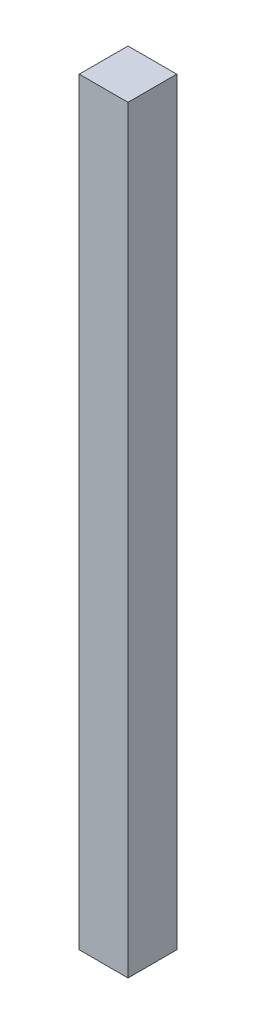
ISO-10303-21;
HEADER;
FILE_DESCRIPTION(('STEP AP214'),'2;1');
FILE_NAME('part.step','',(''),(''),'','','');
FILE_SCHEMA(('AUTOMOTIVE_DESIGN { 1 0 10303 214 1 1 1 1 }'));
ENDSEC;
DATA;
#1=APPLICATION_CONTEXT('core data for automotive mechanical design processes');
#2=APPLICATION_PROTOCOL_DEFINITION('international standard','automotive_design',2000,#1);
#3=PRODUCT_CONTEXT('',#1,'mechanical');
#4=PRODUCT('Part','Part','',(#3));
#5=PRODUCT_RELATED_PRODUCT_CATEGORY('part','',(#4));
#6=PRODUCT_DEFINITION_FORMATION('','',#4);
#7=PRODUCT_DEFINITION_CONTEXT('part definition',#1,'design');
#8=PRODUCT_DEFINITION('design','',#6,#7);
#9=PRODUCT_DEFINITION_SHAPE('','',#8);
#10=(LENGTH_UNIT() NAMED_UNIT(*) SI_UNIT(.MILLI.,.METRE.));
#11=(NAMED_UNIT(*) PLANE_ANGLE_UNIT() SI_UNIT($,.RADIAN.));
#12=(NAMED_UNIT(*) SI_UNIT($,.STERADIAN.) SOLID_ANGLE_UNIT());
#13=UNCERTAINTY_MEASURE_WITH_UNIT(LENGTH_MEASURE(1.E-05),#10,'distance_accuracy_value','');
#14=(GEOMETRIC_REPRESENTATION_CONTEXT(3) GLOBAL_UNCERTAINTY_ASSIGNED_CONTEXT((#13)) GLOBAL_UNIT_ASSIGNED_CONTEXT((#10,
#11,#12)) REPRESENTATION_CONTEXT('',''));
#15=CARTESIAN_POINT('',(0.,0.,0.));
#16=DIRECTION('',(0.,0.,1.));
#17=DIRECTION('',(1.,0.,0.));
#18=AXIS2_PLACEMENT_3D('',#15,#16,#17);
#19=CARTESIAN_POINT('',(0.,311.,0.));
#20=DIRECTION('',(1.,0.,0.));
#21=DIRECTION('',(0.,0.,-1.));
#22=AXIS2_PLACEMENT_3D('',#19,#20,#21);
#23=PLANE('',#22);
#24=DIRECTION('',(0.,0.,1.));
#25=VECTOR('',#24,1.);
#26=CARTESIAN_POINT('',(0.,0.,0.));
#27=LINE('',#26,#25);
#28=CARTESIAN_POINT('',(0.,0.,-20.));
#29=VERTEX_POINT('',#28);
#30=CARTESIAN_POINT('',(0.,0.,0.));
#31=VERTEX_POINT('',#30);
#32=EDGE_CURVE('E107',#29,#31,#27,.T.);
#33=ORIENTED_EDGE('',*,*,#32,.T.);
#34=DIRECTION('',(0.,-1.,0.));
#35=VECTOR('',#34,1.);
#36=CARTESIAN_POINT('',(0.,311.,0.));
#37=LINE('',#36,#35);
#38=CARTESIAN_POINT('',(0.,311.,0.));
#39=VERTEX_POINT('',#38);
#40=EDGE_CURVE('E11',#39,#31,#37,.T.);
#41=ORIENTED_EDGE('',*,*,#40,.F.);
#42=DIRECTION('',(0.,0.,1.));
#43=VECTOR('',#42,1.);
#44=CARTESIAN_POINT('',(0.,311.,0.));
#45=LINE('',#44,#43);
#46=CARTESIAN_POINT('',(0.,311.,-20.));
#47=VERTEX_POINT('',#46);
#48=EDGE_CURVE('E91',#47,#39,#45,.T.);
#49=ORIENTED_EDGE('',*,*,#48,.F.);
#50=DIRECTION('',(0.,-1.,0.));
#51=VECTOR('',#50,1.);
#52=CARTESIAN_POINT('',(0.,311.,-20.));
#53=LINE('',#52,#51);
#54=EDGE_CURVE('E103',#47,#29,#53,.T.);
#55=ORIENTED_EDGE('',*,*,#54,.T.);
#56=EDGE_LOOP('',(#33,#41,#49,#55));
#57=FACE_BOUND('',#56,.T.);
#58=ADVANCED_FACE('F39',(#57),#23,.F.);
#59=CARTESIAN_POINT('',(0.,311.,0.));
#60=DIRECTION('',(0.,0.,-1.));
#61=DIRECTION('',(-1.,0.,0.));
#62=AXIS2_PLACEMENT_3D('',#59,#60,#61);
#63=PLANE('',#62);
#64=DIRECTION('',(1.,0.,0.));
#65=VECTOR('',#64,1.);
#66=CARTESIAN_POINT('',(0.,0.,0.));
#67=LINE('',#66,#65);
#68=CARTESIAN_POINT('',(20.,0.,0.));
#69=VERTEX_POINT('',#68);
#70=EDGE_CURVE('E96',#31,#69,#67,.T.);
#71=ORIENTED_EDGE('',*,*,#70,.T.);
#72=DIRECTION('',(0.,-1.,0.));
#73=VECTOR('',#72,1.);
#74=CARTESIAN_POINT('',(20.,311.,0.));
#75=LINE('',#74,#73);
#76=CARTESIAN_POINT('',(20.,311.,0.));
#77=VERTEX_POINT('',#76);
#78=EDGE_CURVE('E48',#77,#69,#75,.T.);
#79=ORIENTED_EDGE('',*,*,#78,.F.);
#80=DIRECTION('',(1.,0.,0.));
#81=VECTOR('',#80,1.);
#82=CARTESIAN_POINT('',(0.,311.,0.));
#83=LINE('',#82,#81);
#84=EDGE_CURVE('E86',#39,#77,#83,.T.);
#85=ORIENTED_EDGE('',*,*,#84,.F.);
#86=ORIENTED_EDGE('',*,*,#40,.T.);
#87=EDGE_LOOP('',(#71,#79,#85,#86));
#88=FACE_BOUND('',#87,.T.);
#89=ADVANCED_FACE('F95',(#88),#63,.F.);
#90=CARTESIAN_POINT('',(20.,311.,0.));
#91=DIRECTION('',(-1.,0.,0.));
#92=DIRECTION('',(0.,0.,1.));
#93=AXIS2_PLACEMENT_3D('',#90,#91,#92);
#94=PLANE('',#93);
#95=DIRECTION('',(0.,0.,-1.));
#96=VECTOR('',#95,1.);
#97=CARTESIAN_POINT('',(20.,0.,0.));
#98=LINE('',#97,#96);
#99=CARTESIAN_POINT('',(20.,0.,-20.));
#100=VERTEX_POINT('',#99);
#101=EDGE_CURVE('E73',#69,#100,#98,.T.);
#102=ORIENTED_EDGE('',*,*,#101,.T.);
#103=DIRECTION('',(0.,-1.,0.));
#104=VECTOR('',#103,1.);
#105=CARTESIAN_POINT('',(20.,311.,-20.));
#106=LINE('',#105,#104);
#107=CARTESIAN_POINT('',(20.,311.,-20.));
#108=VERTEX_POINT('',#107);
#109=EDGE_CURVE('E98',#108,#100,#106,.T.);
#110=ORIENTED_EDGE('',*,*,#109,.F.);
#111=DIRECTION('',(0.,0.,-1.));
#112=VECTOR('',#111,1.);
#113=CARTESIAN_POINT('',(20.,311.,0.));
#114=LINE('',#113,#112);
#115=EDGE_CURVE('E89',#77,#108,#114,.T.);
#116=ORIENTED_EDGE('',*,*,#115,.F.);
#117=ORIENTED_EDGE('',*,*,#78,.T.);
#118=EDGE_LOOP('',(#102,#110,#116,#117));
#119=FACE_BOUND('',#118,.T.);
#120=ADVANCED_FACE('F99',(#119),#94,.F.);
#121=CARTESIAN_POINT('',(0.,311.,-20.));
#122=DIRECTION('',(0.,0.,1.));
#123=DIRECTION('',(1.,0.,0.));
#124=AXIS2_PLACEMENT_3D('',#121,#122,#123);
#125=PLANE('',#124);
#126=DIRECTION('',(-1.,0.,0.));
#127=VECTOR('',#126,1.);
#128=CARTESIAN_POINT('',(0.,0.,-20.));
#129=LINE('',#128,#127);
#130=EDGE_CURVE('E79',#100,#29,#129,.T.);
#131=ORIENTED_EDGE('',*,*,#130,.T.);
#132=ORIENTED_EDGE('',*,*,#54,.F.);
#133=DIRECTION('',(-1.,0.,0.));
#134=VECTOR('',#133,1.);
#135=CARTESIAN_POINT('',(0.,311.,-20.));
#136=LINE('',#135,#134);
#137=EDGE_CURVE('E56',#108,#47,#136,.T.);
#138=ORIENTED_EDGE('',*,*,#137,.F.);
#139=ORIENTED_EDGE('',*,*,#109,.T.);
#140=EDGE_LOOP('',(#131,#132,#138,#139));
#141=FACE_BOUND('',#140,.T.);
#142=ADVANCED_FACE('F120',(#141),#125,.F.);
#143=CARTESIAN_POINT('',(0.,311.,0.));
#144=DIRECTION('',(0.,-1.,0.));
#145=DIRECTION('',(0.,0.,-1.));
#146=AXIS2_PLACEMENT_3D('',#143,#144,#145);
#147=PLANE('',#146);
#148=ORIENTED_EDGE('',*,*,#48,.T.);
#149=ORIENTED_EDGE('',*,*,#84,.T.);
#150=ORIENTED_EDGE('',*,*,#115,.T.);
#151=ORIENTED_EDGE('',*,*,#137,.T.);
#152=EDGE_LOOP('',(#148,#149,#150,#151));
#153=FACE_BOUND('',#152,.T.);
#154=ADVANCED_FACE('F87',(#153),#147,.F.);
#155=CARTESIAN_POINT('',(0.,0.,0.));
#156=DIRECTION('',(0.,-1.,0.));
#157=DIRECTION('',(0.,0.,-1.));
#158=AXIS2_PLACEMENT_3D('',#155,#156,#157);
#159=PLANE('',#158);
#160=ORIENTED_EDGE('',*,*,#32,.F.);
#161=ORIENTED_EDGE('',*,*,#130,.F.);
#162=ORIENTED_EDGE('',*,*,#101,.F.);
#163=ORIENTED_EDGE('',*,*,#70,.F.);
#164=EDGE_LOOP('',(#160,#161,#162,#163));
#165=FACE_BOUND('',#164,.T.);
#166=ADVANCED_FACE('F123',(#165),#159,.T.);
#167=CLOSED_SHELL('',(#58,#89,#120,#142,#154,#166));
#168=MANIFOLD_SOLID_BREP('B2',#167);
#169=ADVANCED_BREP_SHAPE_REPRESENTATION('',(#18,#168),#14);
#170=SHAPE_DEFINITION_REPRESENTATION(#9,#169);
ENDSEC;
END-ISO-10303-21;
